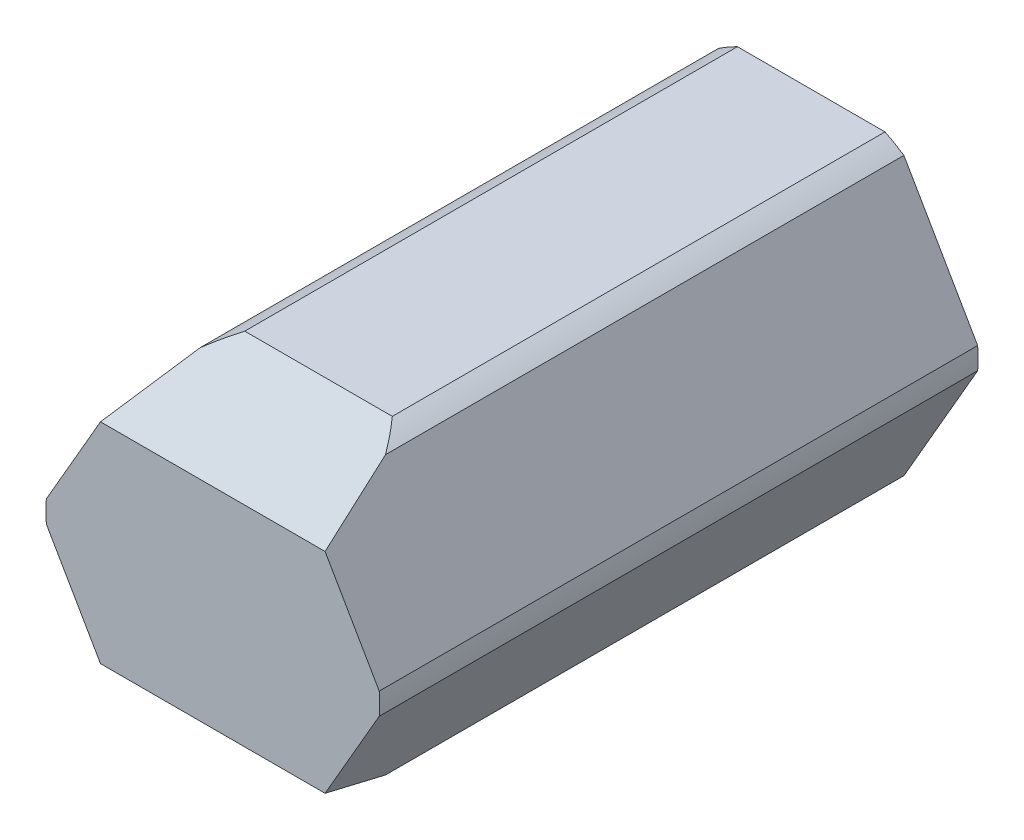
ISO-10303-21;
HEADER;
FILE_DESCRIPTION(('STEP AP214'),'2;1');
FILE_NAME('part.step','',(''),(''),'','','');
FILE_SCHEMA(('AUTOMOTIVE_DESIGN { 1 0 10303 214 1 1 1 1 }'));
ENDSEC;
DATA;
#1=APPLICATION_CONTEXT('core data for automotive mechanical design processes');
#2=APPLICATION_PROTOCOL_DEFINITION('international standard','automotive_design',2000,#1);
#3=PRODUCT_CONTEXT('',#1,'mechanical');
#4=PRODUCT('Part','Part','',(#3));
#5=PRODUCT_RELATED_PRODUCT_CATEGORY('part','',(#4));
#6=PRODUCT_DEFINITION_FORMATION('','',#4);
#7=PRODUCT_DEFINITION_CONTEXT('part definition',#1,'design');
#8=PRODUCT_DEFINITION('design','',#6,#7);
#9=PRODUCT_DEFINITION_SHAPE('','',#8);
#10=(LENGTH_UNIT() NAMED_UNIT(*) SI_UNIT(.MILLI.,.METRE.));
#11=(NAMED_UNIT(*) PLANE_ANGLE_UNIT() SI_UNIT($,.RADIAN.));
#12=(NAMED_UNIT(*) SI_UNIT($,.STERADIAN.) SOLID_ANGLE_UNIT());
#13=UNCERTAINTY_MEASURE_WITH_UNIT(LENGTH_MEASURE(1.E-05),#10,'distance_accuracy_value','');
#14=(GEOMETRIC_REPRESENTATION_CONTEXT(3) GLOBAL_UNCERTAINTY_ASSIGNED_CONTEXT((#13)) GLOBAL_UNIT_ASSIGNED_CONTEXT((#10,
#11,#12)) REPRESENTATION_CONTEXT('',''));
#15=CARTESIAN_POINT('',(0.,0.,0.));
#16=DIRECTION('',(0.,0.,1.));
#17=DIRECTION('',(1.,0.,0.));
#18=AXIS2_PLACEMENT_3D('',#15,#16,#17);
#19=CARTESIAN_POINT('',(0.,0.,-20.));
#20=DIRECTION('',(0.,0.,-1.));
#21=DIRECTION('',(-1.,0.,0.));
#22=AXIS2_PLACEMENT_3D('',#19,#20,#21);
#23=CYLINDRICAL_SURFACE('',#22,5.575);
#24=DIRECTION('',(0.,0.,1.));
#25=VECTOR('',#24,1.);
#26=CARTESIAN_POINT('',(5.56307318563021,-0.364474596264425,-15.));
#27=LINE('',#26,#25);
#28=CARTESIAN_POINT('',(5.56307318563021,-0.364474596264422,-30.));
#29=VERTEX_POINT('',#28);
#30=CARTESIAN_POINT('',(5.56307318563021,-0.364474596264422,-10.));
#31=VERTEX_POINT('',#30);
#32=EDGE_CURVE('E189',#29,#31,#27,.T.);
#33=ORIENTED_EDGE('',*,*,#32,.F.);
#34=CARTESIAN_POINT('',(0.,0.,-30.));
#35=DIRECTION('',(0.,0.,-1.));
#36=DIRECTION('',(-1.,0.,0.));
#37=AXIS2_PLACEMENT_3D('',#34,#35,#36);
#38=CIRCLE('',#37,5.575);
#39=CARTESIAN_POINT('',(5.56307318563021,0.36447459626442,-30.));
#40=VERTEX_POINT('',#39);
#41=EDGE_CURVE('E19',#29,#40,#38,.F.);
#42=ORIENTED_EDGE('',*,*,#41,.T.);
#43=DIRECTION('',(0.,0.,1.));
#44=VECTOR('',#43,1.);
#45=CARTESIAN_POINT('',(5.56307318563021,0.364474596264422,-15.));
#46=LINE('',#45,#44);
#47=CARTESIAN_POINT('',(5.56307318563021,0.364474596264419,-10.));
#48=VERTEX_POINT('',#47);
#49=EDGE_CURVE('E199',#48,#40,#46,.F.);
#50=ORIENTED_EDGE('',*,*,#49,.F.);
#51=CARTESIAN_POINT('',(0.,0.,-10.));
#52=DIRECTION('',(0.,0.,-1.));
#53=DIRECTION('',(-1.,0.,0.));
#54=AXIS2_PLACEMENT_3D('',#51,#52,#53);
#55=CIRCLE('',#54,5.575);
#56=EDGE_CURVE('E220',#31,#48,#55,.F.);
#57=ORIENTED_EDGE('',*,*,#56,.F.);
#58=EDGE_LOOP('',(#33,#42,#50,#57));
#59=FACE_BOUND('',#58,.T.);
#60=ADVANCED_FACE('F16',(#59),#23,.T.);
#61=CARTESIAN_POINT('',(0.,0.,-20.));
#62=DIRECTION('',(0.,0.,-1.));
#63=DIRECTION('',(-1.,0.,0.));
#64=AXIS2_PLACEMENT_3D('',#61,#62,#63);
#65=CYLINDRICAL_SURFACE('',#64,5.575);
#66=DIRECTION('',(0.,0.,-1.));
#67=VECTOR('',#66,1.);
#68=CARTESIAN_POINT('',(2.46589233341604,-5.,-15.));
#69=LINE('',#68,#67);
#70=CARTESIAN_POINT('',(2.46589233341604,-5.,-30.));
#71=VERTEX_POINT('',#70);
#72=CARTESIAN_POINT('',(2.46589233341605,-5.,-13.5337785487356));
#73=VERTEX_POINT('',#72);
#74=EDGE_CURVE('E183',#71,#73,#69,.F.);
#75=ORIENTED_EDGE('',*,*,#74,.F.);
#76=CARTESIAN_POINT('',(0.,0.,-30.));
#77=DIRECTION('',(0.,0.,-1.));
#78=DIRECTION('',(-1.,0.,0.));
#79=AXIS2_PLACEMENT_3D('',#76,#77,#78);
#80=CIRCLE('',#79,5.575);
#81=CARTESIAN_POINT('',(3.09718085221417,-4.63552540373558,-30.));
#82=VERTEX_POINT('',#81);
#83=EDGE_CURVE('E261',#71,#82,#80,.F.);
#84=ORIENTED_EDGE('',*,*,#83,.T.);
#85=DIRECTION('',(0.,0.,1.));
#86=VECTOR('',#85,1.);
#87=CARTESIAN_POINT('',(3.09718085221417,-4.63552540373558,-15.));
#88=LINE('',#87,#86);
#89=CARTESIAN_POINT('',(3.09718085221416,-4.63552540373559,-12.6751302088434));
#90=VERTEX_POINT('',#89);
#91=EDGE_CURVE('E188',#90,#82,#88,.F.);
#92=ORIENTED_EDGE('',*,*,#91,.F.);
#93=CARTESIAN_POINT('',(0.,0.,-1.75451671961685));
#94=DIRECTION('',(0.,-0.920504853452441,0.390731128489273));
#95=DIRECTION('',(0.,-0.390731128489273,-0.920504853452441));
#96=AXIS2_PLACEMENT_3D('',#93,#94,#95);
#97=ELLIPSE('',#96,14.2681235087546,5.575);
#98=EDGE_CURVE('E256',#73,#90,#97,.T.);
#99=ORIENTED_EDGE('',*,*,#98,.F.);
#100=EDGE_LOOP('',(#75,#84,#92,#99));
#101=FACE_BOUND('',#100,.T.);
#102=ADVANCED_FACE('F265',(#101),#65,.T.);
#103=CARTESIAN_POINT('',(0.,0.,-20.));
#104=DIRECTION('',(0.,0.,-1.));
#105=DIRECTION('',(-1.,0.,0.));
#106=AXIS2_PLACEMENT_3D('',#103,#104,#105);
#107=CYLINDRICAL_SURFACE('',#106,5.575);
#108=DIRECTION('',(0.,0.,1.));
#109=VECTOR('',#108,1.);
#110=CARTESIAN_POINT('',(-3.09718085221417,-4.63552540373558,-15.));
#111=LINE('',#110,#109);
#112=CARTESIAN_POINT('',(-3.09718085221417,-4.63552540373558,-30.));
#113=VERTEX_POINT('',#112);
#114=CARTESIAN_POINT('',(-3.09718085221416,-4.63552540373559,-12.6751302088434));
#115=VERTEX_POINT('',#114);
#116=EDGE_CURVE('E176',#113,#115,#111,.T.);
#117=ORIENTED_EDGE('',*,*,#116,.F.);
#118=CARTESIAN_POINT('',(0.,0.,-30.));
#119=DIRECTION('',(0.,0.,-1.));
#120=DIRECTION('',(-1.,0.,0.));
#121=AXIS2_PLACEMENT_3D('',#118,#119,#120);
#122=CIRCLE('',#121,5.575);
#123=CARTESIAN_POINT('',(-2.46589233341603,-5.,-30.));
#124=VERTEX_POINT('',#123);
#125=EDGE_CURVE('E260',#113,#124,#122,.F.);
#126=ORIENTED_EDGE('',*,*,#125,.T.);
#127=DIRECTION('',(0.,0.,-1.));
#128=VECTOR('',#127,1.);
#129=CARTESIAN_POINT('',(-2.46589233341603,-5.,-15.));
#130=LINE('',#129,#128);
#131=CARTESIAN_POINT('',(-2.46589233341605,-5.,-13.5337785487356));
#132=VERTEX_POINT('',#131);
#133=EDGE_CURVE('E185',#132,#124,#130,.T.);
#134=ORIENTED_EDGE('',*,*,#133,.F.);
#135=CARTESIAN_POINT('',(0.,0.,-1.75451671961685));
#136=DIRECTION('',(0.,-0.920504853452441,0.390731128489273));
#137=DIRECTION('',(0.,-0.390731128489273,-0.920504853452441));
#138=AXIS2_PLACEMENT_3D('',#135,#136,#137);
#139=ELLIPSE('',#138,14.2681235087546,5.575);
#140=EDGE_CURVE('E258',#115,#132,#139,.T.);
#141=ORIENTED_EDGE('',*,*,#140,.F.);
#142=EDGE_LOOP('',(#117,#126,#134,#141));
#143=FACE_BOUND('',#142,.T.);
#144=ADVANCED_FACE('F285',(#143),#107,.T.);
#145=CARTESIAN_POINT('',(0.,-3.5,-10.));
#146=DIRECTION('',(0.,-0.920504853452441,0.390731128489273));
#147=DIRECTION('',(0.,-0.390731128489273,-0.920504853452441));
#148=AXIS2_PLACEMENT_3D('',#145,#146,#147);
#149=PLANE('',#148);
#150=DIRECTION('',(1.,0.,0.));
#151=VECTOR('',#150,1.);
#152=CARTESIAN_POINT('',(0.,-5.,-13.5337785487356));
#153=LINE('',#152,#151);
#154=EDGE_CURVE('E182',#73,#132,#153,.F.);
#155=ORIENTED_EDGE('',*,*,#154,.F.);
#156=ORIENTED_EDGE('',*,*,#98,.T.);
#157=DIRECTION('',(-0.220058778765475,-0.381152985473362,-0.897940162568192));
#158=VECTOR('',#157,1.);
#159=CARTESIAN_POINT('',(3.75277674973257,-3.5,-10.));
#160=LINE('',#159,#158);
#161=CARTESIAN_POINT('',(3.75277674973257,-3.5,-10.));
#162=VERTEX_POINT('',#161);
#163=EDGE_CURVE('E195',#162,#90,#160,.T.);
#164=ORIENTED_EDGE('',*,*,#163,.F.);
#165=DIRECTION('',(1.,0.,0.));
#166=VECTOR('',#165,1.);
#167=CARTESIAN_POINT('',(0.,-3.5,-10.));
#168=LINE('',#167,#166);
#169=CARTESIAN_POINT('',(-3.75277674973257,-3.5,-10.));
#170=VERTEX_POINT('',#169);
#171=EDGE_CURVE('E218',#170,#162,#168,.T.);
#172=ORIENTED_EDGE('',*,*,#171,.F.);
#173=DIRECTION('',(-0.220058778765475,0.381152985473362,0.897940162568192));
#174=VECTOR('',#173,1.);
#175=CARTESIAN_POINT('',(-3.09718085221417,-4.63552540373558,-12.6751302088434));
#176=LINE('',#175,#174);
#177=EDGE_CURVE('E178',#115,#170,#176,.T.);
#178=ORIENTED_EDGE('',*,*,#177,.F.);
#179=ORIENTED_EDGE('',*,*,#140,.T.);
#180=EDGE_LOOP('',(#155,#156,#164,#172,#178,#179));
#181=FACE_BOUND('',#180,.T.);
#182=ADVANCED_FACE('F276',(#181),#149,.T.);
#183=CARTESIAN_POINT('',(0.,0.,-20.));
#184=DIRECTION('',(0.,0.,-1.));
#185=DIRECTION('',(-1.,0.,0.));
#186=AXIS2_PLACEMENT_3D('',#183,#184,#185);
#187=CYLINDRICAL_SURFACE('',#186,5.575);
#188=DIRECTION('',(0.,0.,1.));
#189=VECTOR('',#188,1.);
#190=CARTESIAN_POINT('',(-5.56307318563021,0.364474596264423,-15.));
#191=LINE('',#190,#189);
#192=CARTESIAN_POINT('',(-5.56307318563021,0.364474596264421,-30.));
#193=VERTEX_POINT('',#192);
#194=CARTESIAN_POINT('',(-5.56307318563021,0.364474596264419,-10.));
#195=VERTEX_POINT('',#194);
#196=EDGE_CURVE('E172',#193,#195,#191,.T.);
#197=ORIENTED_EDGE('',*,*,#196,.F.);
#198=CARTESIAN_POINT('',(0.,0.,-30.));
#199=DIRECTION('',(0.,0.,-1.));
#200=DIRECTION('',(-1.,0.,0.));
#201=AXIS2_PLACEMENT_3D('',#198,#199,#200);
#202=CIRCLE('',#201,5.575);
#203=CARTESIAN_POINT('',(-5.56307318563021,-0.364474596264417,-30.));
#204=VERTEX_POINT('',#203);
#205=EDGE_CURVE('E149',#193,#204,#202,.F.);
#206=ORIENTED_EDGE('',*,*,#205,.T.);
#207=DIRECTION('',(0.,0.,1.));
#208=VECTOR('',#207,1.);
#209=CARTESIAN_POINT('',(-5.56307318563021,-0.364474596264421,-15.));
#210=LINE('',#209,#208);
#211=CARTESIAN_POINT('',(-5.56307318563021,-0.364474596264418,-10.));
#212=VERTEX_POINT('',#211);
#213=EDGE_CURVE('E179',#212,#204,#210,.F.);
#214=ORIENTED_EDGE('',*,*,#213,.F.);
#215=CARTESIAN_POINT('',(0.,0.,-10.));
#216=DIRECTION('',(0.,0.,-1.));
#217=DIRECTION('',(-1.,0.,0.));
#218=AXIS2_PLACEMENT_3D('',#215,#216,#217);
#219=CIRCLE('',#218,5.575);
#220=EDGE_CURVE('E221',#195,#212,#219,.F.);
#221=ORIENTED_EDGE('',*,*,#220,.F.);
#222=EDGE_LOOP('',(#197,#206,#214,#221));
#223=FACE_BOUND('',#222,.T.);
#224=ADVANCED_FACE('F292',(#223),#187,.T.);
#225=CARTESIAN_POINT('',(0.,0.,-10.));
#226=DIRECTION('',(0.,0.,1.));
#227=DIRECTION('',(1.,0.,0.));
#228=AXIS2_PLACEMENT_3D('',#225,#226,#227);
#229=PLANE('',#228);
#230=DIRECTION('',(0.5,0.866025403784438,0.));
#231=VECTOR('',#230,1.);
#232=CARTESIAN_POINT('',(4.33012701892219,-2.5,-10.));
#233=LINE('',#232,#231);
#234=EDGE_CURVE('E191',#31,#162,#233,.F.);
#235=ORIENTED_EDGE('',*,*,#234,.F.);
#236=ORIENTED_EDGE('',*,*,#56,.T.);
#237=DIRECTION('',(-0.5,0.866025403784439,0.));
#238=VECTOR('',#237,1.);
#239=CARTESIAN_POINT('',(4.33012701892219,2.5,-10.));
#240=LINE('',#239,#238);
#241=CARTESIAN_POINT('',(3.75277674973257,3.5,-10.));
#242=VERTEX_POINT('',#241);
#243=EDGE_CURVE('E192',#242,#48,#240,.F.);
#244=ORIENTED_EDGE('',*,*,#243,.F.);
#245=DIRECTION('',(1.,0.,0.));
#246=VECTOR('',#245,1.);
#247=CARTESIAN_POINT('',(0.,3.5,-10.));
#248=LINE('',#247,#246);
#249=CARTESIAN_POINT('',(-3.75277674973257,3.5,-10.));
#250=VERTEX_POINT('',#249);
#251=EDGE_CURVE('E201',#250,#242,#248,.T.);
#252=ORIENTED_EDGE('',*,*,#251,.F.);
#253=DIRECTION('',(-0.5,-0.866025403784439,0.));
#254=VECTOR('',#253,1.);
#255=CARTESIAN_POINT('',(-4.33012701892219,2.5,-10.));
#256=LINE('',#255,#254);
#257=EDGE_CURVE('E173',#195,#250,#256,.F.);
#258=ORIENTED_EDGE('',*,*,#257,.F.);
#259=ORIENTED_EDGE('',*,*,#220,.T.);
#260=DIRECTION('',(0.5,-0.866025403784439,0.));
#261=VECTOR('',#260,1.);
#262=CARTESIAN_POINT('',(-4.33012701892219,-2.5,-10.));
#263=LINE('',#262,#261);
#264=EDGE_CURVE('E174',#170,#212,#263,.F.);
#265=ORIENTED_EDGE('',*,*,#264,.F.);
#266=ORIENTED_EDGE('',*,*,#171,.T.);
#267=EDGE_LOOP('',(#235,#236,#244,#252,#258,#259,#265,#266));
#268=FACE_BOUND('',#267,.T.);
#269=ADVANCED_FACE('F297',(#268),#229,.T.);
#270=CARTESIAN_POINT('',(0.,0.,-20.));
#271=DIRECTION('',(0.,0.,-1.));
#272=DIRECTION('',(-1.,0.,0.));
#273=AXIS2_PLACEMENT_3D('',#270,#271,#272);
#274=CYLINDRICAL_SURFACE('',#273,5.575);
#275=DIRECTION('',(0.,0.,1.));
#276=VECTOR('',#275,1.);
#277=CARTESIAN_POINT('',(2.46589233341603,5.,-15.));
#278=LINE('',#277,#276);
#279=CARTESIAN_POINT('',(2.46589233341605,5.,-13.5337785487356));
#280=VERTEX_POINT('',#279);
#281=CARTESIAN_POINT('',(2.46589233341603,5.,-30.));
#282=VERTEX_POINT('',#281);
#283=EDGE_CURVE('E144',#280,#282,#278,.F.);
#284=ORIENTED_EDGE('',*,*,#283,.F.);
#285=CARTESIAN_POINT('',(0.,0.,-1.75451671961685));
#286=DIRECTION('',(0.,0.920504853452441,0.390731128489273));
#287=DIRECTION('',(0.,0.390731128489273,-0.920504853452441));
#288=AXIS2_PLACEMENT_3D('',#285,#286,#287);
#289=ELLIPSE('',#288,14.2681235087546,5.575);
#290=CARTESIAN_POINT('',(3.09718085221416,4.63552540373559,-12.6751302088434));
#291=VERTEX_POINT('',#290);
#292=EDGE_CURVE('E135',#291,#280,#289,.T.);
#293=ORIENTED_EDGE('',*,*,#292,.F.);
#294=DIRECTION('',(0.,0.,1.));
#295=VECTOR('',#294,1.);
#296=CARTESIAN_POINT('',(3.09718085221417,4.63552540373558,-15.));
#297=LINE('',#296,#295);
#298=CARTESIAN_POINT('',(3.09718085221417,4.63552540373558,-30.));
#299=VERTEX_POINT('',#298);
#300=EDGE_CURVE('E196',#299,#291,#297,.T.);
#301=ORIENTED_EDGE('',*,*,#300,.F.);
#302=CARTESIAN_POINT('',(0.,0.,-30.));
#303=DIRECTION('',(0.,0.,-1.));
#304=DIRECTION('',(-1.,0.,0.));
#305=AXIS2_PLACEMENT_3D('',#302,#303,#304);
#306=CIRCLE('',#305,5.575);
#307=EDGE_CURVE('E34',#299,#282,#306,.F.);
#308=ORIENTED_EDGE('',*,*,#307,.T.);
#309=EDGE_LOOP('',(#284,#293,#301,#308));
#310=FACE_BOUND('',#309,.T.);
#311=ADVANCED_FACE('F305',(#310),#274,.T.);
#312=CARTESIAN_POINT('',(0.,0.,-20.));
#313=DIRECTION('',(0.,0.,-1.));
#314=DIRECTION('',(-1.,0.,0.));
#315=AXIS2_PLACEMENT_3D('',#312,#313,#314);
#316=CYLINDRICAL_SURFACE('',#315,5.575);
#317=DIRECTION('',(0.,0.,1.));
#318=VECTOR('',#317,1.);
#319=CARTESIAN_POINT('',(-2.46589233341604,5.,-15.));
#320=LINE('',#319,#318);
#321=CARTESIAN_POINT('',(-2.46589233341604,5.,-30.));
#322=VERTEX_POINT('',#321);
#323=CARTESIAN_POINT('',(-2.46589233341605,5.,-13.5337785487356));
#324=VERTEX_POINT('',#323);
#325=EDGE_CURVE('E132',#322,#324,#320,.T.);
#326=ORIENTED_EDGE('',*,*,#325,.F.);
#327=CARTESIAN_POINT('',(0.,0.,-30.));
#328=DIRECTION('',(0.,0.,-1.));
#329=DIRECTION('',(-1.,0.,0.));
#330=AXIS2_PLACEMENT_3D('',#327,#328,#329);
#331=CIRCLE('',#330,5.575);
#332=CARTESIAN_POINT('',(-3.09718085221417,4.63552540373558,-30.));
#333=VERTEX_POINT('',#332);
#334=EDGE_CURVE('E127',#322,#333,#331,.F.);
#335=ORIENTED_EDGE('',*,*,#334,.T.);
#336=DIRECTION('',(0.,0.,1.));
#337=VECTOR('',#336,1.);
#338=CARTESIAN_POINT('',(-3.09718085221417,4.63552540373558,-15.));
#339=LINE('',#338,#337);
#340=CARTESIAN_POINT('',(-3.09718085221416,4.63552540373559,-12.6751302088434));
#341=VERTEX_POINT('',#340);
#342=EDGE_CURVE('E131',#341,#333,#339,.F.);
#343=ORIENTED_EDGE('',*,*,#342,.F.);
#344=CARTESIAN_POINT('',(0.,0.,-1.75451671961685));
#345=DIRECTION('',(0.,0.920504853452441,0.390731128489273));
#346=DIRECTION('',(0.,0.390731128489273,-0.920504853452441));
#347=AXIS2_PLACEMENT_3D('',#344,#345,#346);
#348=ELLIPSE('',#347,14.2681235087546,5.575);
#349=EDGE_CURVE('E208',#324,#341,#348,.T.);
#350=ORIENTED_EDGE('',*,*,#349,.F.);
#351=EDGE_LOOP('',(#326,#335,#343,#350));
#352=FACE_BOUND('',#351,.T.);
#353=ADVANCED_FACE('F129',(#352),#316,.T.);
#354=CARTESIAN_POINT('',(0.,3.5,-10.));
#355=DIRECTION('',(0.,0.920504853452441,0.390731128489273));
#356=DIRECTION('',(0.,-0.390731128489273,0.920504853452441));
#357=AXIS2_PLACEMENT_3D('',#354,#355,#356);
#358=PLANE('',#357);
#359=DIRECTION('',(0.220058778765475,0.381152985473362,-0.897940162568192));
#360=VECTOR('',#359,1.);
#361=CARTESIAN_POINT('',(-3.75277674973257,3.5,-10.));
#362=LINE('',#361,#360);
#363=EDGE_CURVE('E143',#250,#341,#362,.T.);
#364=ORIENTED_EDGE('',*,*,#363,.F.);
#365=ORIENTED_EDGE('',*,*,#251,.T.);
#366=DIRECTION('',(0.220058778765475,-0.381152985473362,0.897940162568192));
#367=VECTOR('',#366,1.);
#368=CARTESIAN_POINT('',(3.09718085221417,4.63552540373558,-12.6751302088434));
#369=LINE('',#368,#367);
#370=EDGE_CURVE('E198',#291,#242,#369,.T.);
#371=ORIENTED_EDGE('',*,*,#370,.F.);
#372=ORIENTED_EDGE('',*,*,#292,.T.);
#373=DIRECTION('',(1.,0.,0.));
#374=VECTOR('',#373,1.);
#375=CARTESIAN_POINT('',(0.,5.,-13.5337785487356));
#376=LINE('',#375,#374);
#377=EDGE_CURVE('E166',#324,#280,#376,.T.);
#378=ORIENTED_EDGE('',*,*,#377,.F.);
#379=ORIENTED_EDGE('',*,*,#349,.T.);
#380=EDGE_LOOP('',(#364,#365,#371,#372,#378,#379));
#381=FACE_BOUND('',#380,.T.);
#382=ADVANCED_FACE('F300',(#381),#358,.T.);
#383=CARTESIAN_POINT('',(4.33012701892219,2.5,-15.));
#384=DIRECTION('',(0.866025403784439,0.5,0.));
#385=DIRECTION('',(-0.5,0.866025403784439,0.));
#386=AXIS2_PLACEMENT_3D('',#383,#384,#385);
#387=PLANE('',#386);
#388=ORIENTED_EDGE('',*,*,#370,.T.);
#389=ORIENTED_EDGE('',*,*,#243,.T.);
#390=ORIENTED_EDGE('',*,*,#49,.T.);
#391=DIRECTION('',(0.5,-0.866025403784439,0.));
#392=VECTOR('',#391,1.);
#393=CARTESIAN_POINT('',(3.09718085221417,4.63552540373558,-30.));
#394=LINE('',#393,#392);
#395=EDGE_CURVE('E164',#299,#40,#394,.T.);
#396=ORIENTED_EDGE('',*,*,#395,.F.);
#397=ORIENTED_EDGE('',*,*,#300,.T.);
#398=EDGE_LOOP('',(#388,#389,#390,#396,#397));
#399=FACE_BOUND('',#398,.T.);
#400=ADVANCED_FACE('F308',(#399),#387,.T.);
#401=CARTESIAN_POINT('',(4.33012701892219,-2.5,-15.));
#402=DIRECTION('',(0.866025403784438,-0.5,0.));
#403=DIRECTION('',(0.5,0.866025403784438,0.));
#404=AXIS2_PLACEMENT_3D('',#401,#402,#403);
#405=PLANE('',#404);
#406=ORIENTED_EDGE('',*,*,#91,.T.);
#407=DIRECTION('',(-0.5,-0.866025403784439,0.));
#408=VECTOR('',#407,1.);
#409=CARTESIAN_POINT('',(5.56307318563021,-0.364474596264425,-30.));
#410=LINE('',#409,#408);
#411=EDGE_CURVE('E162',#29,#82,#410,.T.);
#412=ORIENTED_EDGE('',*,*,#411,.F.);
#413=ORIENTED_EDGE('',*,*,#32,.T.);
#414=ORIENTED_EDGE('',*,*,#234,.T.);
#415=ORIENTED_EDGE('',*,*,#163,.T.);
#416=EDGE_LOOP('',(#406,#412,#413,#414,#415));
#417=FACE_BOUND('',#416,.T.);
#418=ADVANCED_FACE('F270',(#417),#405,.T.);
#419=CARTESIAN_POINT('',(0.,-5.,-15.));
#420=DIRECTION('',(0.,-1.,0.));
#421=DIRECTION('',(0.,0.,-1.));
#422=AXIS2_PLACEMENT_3D('',#419,#420,#421);
#423=PLANE('',#422);
#424=ORIENTED_EDGE('',*,*,#74,.T.);
#425=ORIENTED_EDGE('',*,*,#154,.T.);
#426=ORIENTED_EDGE('',*,*,#133,.T.);
#427=DIRECTION('',(-1.,0.,0.));
#428=VECTOR('',#427,1.);
#429=CARTESIAN_POINT('',(0.,-5.,-30.));
#430=LINE('',#429,#428);
#431=EDGE_CURVE('E156',#71,#124,#430,.T.);
#432=ORIENTED_EDGE('',*,*,#431,.F.);
#433=EDGE_LOOP('',(#424,#425,#426,#432));
#434=FACE_BOUND('',#433,.T.);
#435=ADVANCED_FACE('F282',(#434),#423,.T.);
#436=CARTESIAN_POINT('',(-4.33012701892219,-2.5,-15.));
#437=DIRECTION('',(-0.866025403784439,-0.5,0.));
#438=DIRECTION('',(0.5,-0.866025403784439,0.));
#439=AXIS2_PLACEMENT_3D('',#436,#437,#438);
#440=PLANE('',#439);
#441=ORIENTED_EDGE('',*,*,#177,.T.);
#442=ORIENTED_EDGE('',*,*,#264,.T.);
#443=ORIENTED_EDGE('',*,*,#213,.T.);
#444=DIRECTION('',(-0.5,0.866025403784439,0.));
#445=VECTOR('',#444,1.);
#446=CARTESIAN_POINT('',(-3.09718085221417,-4.63552540373558,-30.));
#447=LINE('',#446,#445);
#448=EDGE_CURVE('E152',#113,#204,#447,.T.);
#449=ORIENTED_EDGE('',*,*,#448,.F.);
#450=ORIENTED_EDGE('',*,*,#116,.T.);
#451=EDGE_LOOP('',(#441,#442,#443,#449,#450));
#452=FACE_BOUND('',#451,.T.);
#453=ADVANCED_FACE('F288',(#452),#440,.T.);
#454=CARTESIAN_POINT('',(-4.33012701892219,2.5,-15.));
#455=DIRECTION('',(-0.866025403784439,0.5,0.));
#456=DIRECTION('',(-0.5,-0.866025403784439,0.));
#457=AXIS2_PLACEMENT_3D('',#454,#455,#456);
#458=PLANE('',#457);
#459=ORIENTED_EDGE('',*,*,#342,.T.);
#460=DIRECTION('',(0.5,0.866025403784439,0.));
#461=VECTOR('',#460,1.);
#462=CARTESIAN_POINT('',(-5.56307318563021,0.364474596264424,-30.));
#463=LINE('',#462,#461);
#464=EDGE_CURVE('E141',#193,#333,#463,.T.);
#465=ORIENTED_EDGE('',*,*,#464,.F.);
#466=ORIENTED_EDGE('',*,*,#196,.T.);
#467=ORIENTED_EDGE('',*,*,#257,.T.);
#468=ORIENTED_EDGE('',*,*,#363,.T.);
#469=EDGE_LOOP('',(#459,#465,#466,#467,#468));
#470=FACE_BOUND('',#469,.T.);
#471=ADVANCED_FACE('F140',(#470),#458,.T.);
#472=CARTESIAN_POINT('',(0.,5.,-15.));
#473=DIRECTION('',(0.,1.,0.));
#474=DIRECTION('',(0.,0.,1.));
#475=AXIS2_PLACEMENT_3D('',#472,#473,#474);
#476=PLANE('',#475);
#477=ORIENTED_EDGE('',*,*,#325,.T.);
#478=ORIENTED_EDGE('',*,*,#377,.T.);
#479=ORIENTED_EDGE('',*,*,#283,.T.);
#480=DIRECTION('',(-1.,0.,0.));
#481=VECTOR('',#480,1.);
#482=CARTESIAN_POINT('',(0.,5.,-30.));
#483=LINE('',#482,#481);
#484=EDGE_CURVE('E151',#322,#282,#483,.F.);
#485=ORIENTED_EDGE('',*,*,#484,.F.);
#486=EDGE_LOOP('',(#477,#478,#479,#485));
#487=FACE_BOUND('',#486,.T.);
#488=ADVANCED_FACE('F304',(#487),#476,.T.);
#489=CARTESIAN_POINT('',(0.,0.,-14.4999999999413));
#490=DIRECTION('',(0.,0.,-1.));
#491=DIRECTION('',(-1.,0.,0.));
#492=AXIS2_PLACEMENT_3D('',#489,#490,#491);
#493=CONICAL_SURFACE('',#492,2.3999999998523,1.0471975511896);
#494=CARTESIAN_POINT('',(0.,0.,-14.5));
#495=DIRECTION('',(0.,0.,1.));
#496=DIRECTION('',(1.,0.,0.));
#497=AXIS2_PLACEMENT_3D('',#494,#495,#496);
#498=CIRCLE('',#497,2.4);
#499=CARTESIAN_POINT('',(2.4,0.,-14.5));
#500=VERTEX_POINT('',#499);
#501=EDGE_CURVE('E154',#500,#500,#498,.F.);
#502=ORIENTED_EDGE('',*,*,#501,.T.);
#503=EDGE_LOOP('',(#502));
#504=FACE_BOUND('',#503,.T.);
#505=CARTESIAN_POINT('',(0.,1.13686837721616E-10,-13.1143593538923));
#506=VERTEX_POINT('',#505);
#507=VERTEX_LOOP('',#506);
#508=FACE_BOUND('',#507,.T.);
#509=ADVANCED_FACE('F338',(#504,#508),#493,.F.);
#510=CARTESIAN_POINT('',(0.,0.,-30.));
#511=DIRECTION('',(0.,0.,-1.));
#512=DIRECTION('',(-1.,0.,0.));
#513=AXIS2_PLACEMENT_3D('',#510,#511,#512);
#514=PLANE('',#513);
#515=ORIENTED_EDGE('',*,*,#484,.T.);
#516=ORIENTED_EDGE('',*,*,#307,.F.);
#517=ORIENTED_EDGE('',*,*,#395,.T.);
#518=ORIENTED_EDGE('',*,*,#41,.F.);
#519=ORIENTED_EDGE('',*,*,#411,.T.);
#520=ORIENTED_EDGE('',*,*,#83,.F.);
#521=ORIENTED_EDGE('',*,*,#431,.T.);
#522=ORIENTED_EDGE('',*,*,#125,.F.);
#523=ORIENTED_EDGE('',*,*,#448,.T.);
#524=ORIENTED_EDGE('',*,*,#205,.F.);
#525=ORIENTED_EDGE('',*,*,#464,.T.);
#526=ORIENTED_EDGE('',*,*,#334,.F.);
#527=EDGE_LOOP('',(#515,#516,#517,#518,#519,#520,#521,#522,#523,#524,#525,#526));
#528=FACE_BOUND('',#527,.T.);
#529=CARTESIAN_POINT('',(0.,0.,-30.0000000000296));
#530=DIRECTION('',(0.,0.,-1.));
#531=DIRECTION('',(-1.,0.,0.));
#532=AXIS2_PLACEMENT_3D('',#529,#530,#531);
#533=CIRCLE('',#532,2.9999999999859);
#534=CARTESIAN_POINT('',(-2.9999999999859,0.,-30.0000000000296));
#535=VERTEX_POINT('',#534);
#536=EDGE_CURVE('E169',#535,#535,#533,.F.);
#537=ORIENTED_EDGE('',*,*,#536,.T.);
#538=EDGE_LOOP('',(#537));
#539=FACE_BOUND('',#538,.T.);
#540=ADVANCED_FACE('F146',(#528,#539),#514,.T.);
#541=CARTESIAN_POINT('',(0.,0.,-15.5));
#542=DIRECTION('',(0.,0.,1.));
#543=DIRECTION('',(1.,0.,0.));
#544=AXIS2_PLACEMENT_3D('',#541,#542,#543);
#545=CYLINDRICAL_SURFACE('',#544,2.4);
#546=ORIENTED_EDGE('',*,*,#501,.F.);
#547=EDGE_LOOP('',(#546));
#548=FACE_BOUND('',#547,.T.);
#549=CARTESIAN_POINT('',(0.,0.,-16.5));
#550=DIRECTION('',(0.,0.,1.));
#551=DIRECTION('',(1.,0.,0.));
#552=AXIS2_PLACEMENT_3D('',#549,#550,#551);
#553=CIRCLE('',#552,2.4);
#554=CARTESIAN_POINT('',(2.4,0.,-16.5));
#555=VERTEX_POINT('',#554);
#556=EDGE_CURVE('E245',#555,#555,#553,.T.);
#557=ORIENTED_EDGE('',*,*,#556,.F.);
#558=EDGE_LOOP('',(#557));
#559=FACE_BOUND('',#558,.T.);
#560=ADVANCED_FACE('F331',(#548,#559),#545,.F.);
#561=CARTESIAN_POINT('',(0.,0.,-30.0000000000296));
#562=DIRECTION('',(0.,0.,-1.));
#563=DIRECTION('',(-1.,0.,0.));
#564=AXIS2_PLACEMENT_3D('',#561,#562,#563);
#565=CONICAL_SURFACE('',#564,2.9999999999859,0.785398163397448);
#566=CARTESIAN_POINT('',(0.,0.,-29.395));
#567=DIRECTION('',(0.,0.,1.));
#568=DIRECTION('',(1.,0.,0.));
#569=AXIS2_PLACEMENT_3D('',#566,#567,#568);
#570=CIRCLE('',#569,2.395);
#571=CARTESIAN_POINT('',(2.395,0.,-29.395));
#572=VERTEX_POINT('',#571);
#573=EDGE_CURVE('E25',#572,#572,#570,.T.);
#574=ORIENTED_EDGE('',*,*,#573,.T.);
#575=EDGE_LOOP('',(#574));
#576=FACE_BOUND('',#575,.T.);
#577=ORIENTED_EDGE('',*,*,#536,.F.);
#578=EDGE_LOOP('',(#577));
#579=FACE_BOUND('',#578,.T.);
#580=ADVANCED_FACE('F323',(#576,#579),#565,.F.);
#581=CARTESIAN_POINT('',(0.,2.6975,-16.5));
#582=DIRECTION('',(0.,0.,1.));
#583=DIRECTION('',(1.,0.,0.));
#584=AXIS2_PLACEMENT_3D('',#581,#582,#583);
#585=PLANE('',#584);
#586=ORIENTED_EDGE('',*,*,#556,.T.);
#587=EDGE_LOOP('',(#586));
#588=FACE_BOUND('',#587,.T.);
#589=CARTESIAN_POINT('',(0.,0.,-16.5));
#590=DIRECTION('',(0.,0.,1.));
#591=DIRECTION('',(1.,0.,0.));
#592=AXIS2_PLACEMENT_3D('',#589,#590,#591);
#593=CIRCLE('',#592,2.395);
#594=CARTESIAN_POINT('',(2.395,0.,-16.5));
#595=VERTEX_POINT('',#594);
#596=EDGE_CURVE('E11',#595,#595,#593,.F.);
#597=ORIENTED_EDGE('',*,*,#596,.T.);
#598=EDGE_LOOP('',(#597));
#599=FACE_BOUND('',#598,.T.);
#600=ADVANCED_FACE('F317',(#588,#599),#585,.T.);
#601=CARTESIAN_POINT('',(0.,0.,-22.9475));
#602=DIRECTION('',(0.,0.,1.));
#603=DIRECTION('',(1.,0.,0.));
#604=AXIS2_PLACEMENT_3D('',#601,#602,#603);
#605=CYLINDRICAL_SURFACE('',#604,2.395);
#606=ORIENTED_EDGE('',*,*,#596,.F.);
#607=EDGE_LOOP('',(#606));
#608=FACE_BOUND('',#607,.T.);
#609=ORIENTED_EDGE('',*,*,#573,.F.);
#610=EDGE_LOOP('',(#609));
#611=FACE_BOUND('',#610,.T.);
#612=ADVANCED_FACE('F315',(#608,#611),#605,.F.);
#613=CLOSED_SHELL('',(#60,#102,#144,#182,#224,#269,#311,#353,#382,#400,#418,#435,#453,#471,#488,
#509,#540,#560,#580,#600,#612));
#614=MANIFOLD_SOLID_BREP('B1',#613);
#615=ADVANCED_BREP_SHAPE_REPRESENTATION('',(#18,#614),#14);
#616=SHAPE_DEFINITION_REPRESENTATION(#9,#615);
ENDSEC;
END-ISO-10303-21;
